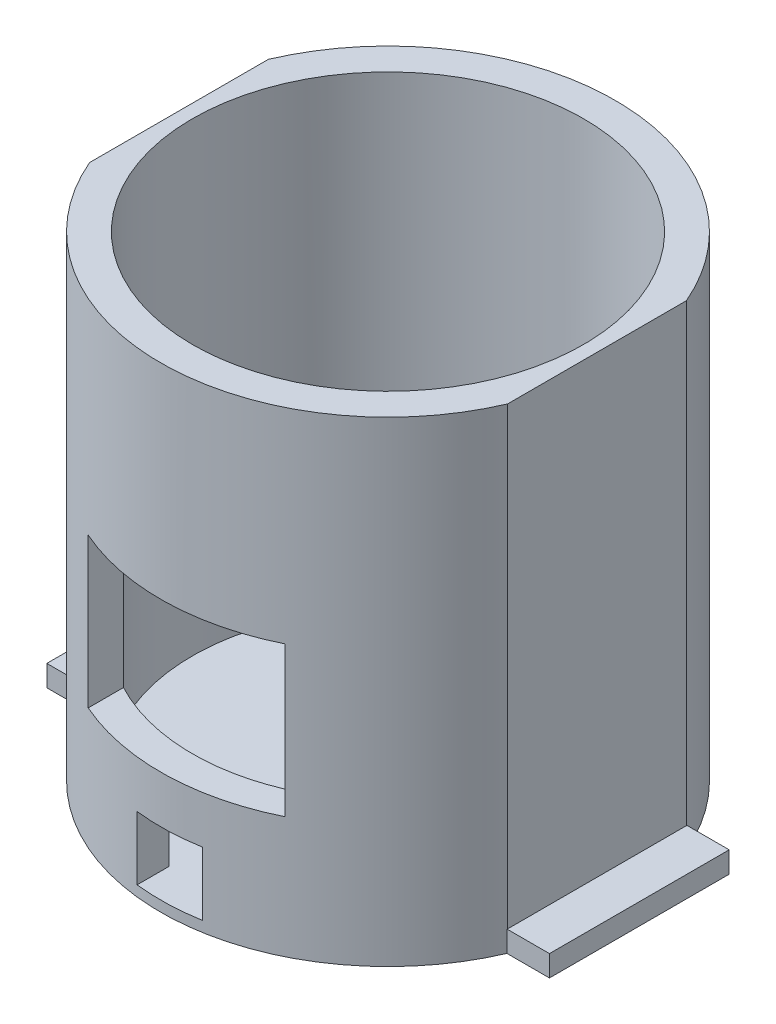
ISO-10303-21;
HEADER;
FILE_DESCRIPTION(('STEP AP214'),'2;1');
FILE_NAME('part.step','',(''),(''),'','','');
FILE_SCHEMA(('AUTOMOTIVE_DESIGN { 1 0 10303 214 1 1 1 1 }'));
ENDSEC;
DATA;
#1=APPLICATION_CONTEXT('core data for automotive mechanical design processes');
#2=APPLICATION_PROTOCOL_DEFINITION('international standard','automotive_design',2000,#1);
#3=PRODUCT_CONTEXT('',#1,'mechanical');
#4=PRODUCT('Part','Part','',(#3));
#5=PRODUCT_RELATED_PRODUCT_CATEGORY('part','',(#4));
#6=PRODUCT_DEFINITION_FORMATION('','',#4);
#7=PRODUCT_DEFINITION_CONTEXT('part definition',#1,'design');
#8=PRODUCT_DEFINITION('design','',#6,#7);
#9=PRODUCT_DEFINITION_SHAPE('','',#8);
#10=(LENGTH_UNIT() NAMED_UNIT(*) SI_UNIT(.MILLI.,.METRE.));
#11=(NAMED_UNIT(*) PLANE_ANGLE_UNIT() SI_UNIT($,.RADIAN.));
#12=(NAMED_UNIT(*) SI_UNIT($,.STERADIAN.) SOLID_ANGLE_UNIT());
#13=UNCERTAINTY_MEASURE_WITH_UNIT(LENGTH_MEASURE(1.E-05),#10,'distance_accuracy_value','');
#14=(GEOMETRIC_REPRESENTATION_CONTEXT(3) GLOBAL_UNCERTAINTY_ASSIGNED_CONTEXT((#13)) GLOBAL_UNIT_ASSIGNED_CONTEXT((#10,
#11,#12)) REPRESENTATION_CONTEXT('',''));
#15=CARTESIAN_POINT('',(0.,0.,0.));
#16=DIRECTION('',(0.,0.,1.));
#17=DIRECTION('',(1.,0.,0.));
#18=AXIS2_PLACEMENT_3D('',#15,#16,#17);
#19=CARTESIAN_POINT('',(19.7690481329593,45.,0.));
#20=DIRECTION('',(1.,0.,0.));
#21=DIRECTION('',(0.,0.,-1.));
#22=AXIS2_PLACEMENT_3D('',#19,#20,#21);
#23=PLANE('',#22);
#24=DIRECTION('',(0.,-1.,0.));
#25=VECTOR('',#24,1.);
#26=CARTESIAN_POINT('',(19.7690481329593,45.,8.45190723545503));
#27=LINE('',#26,#25);
#28=CARTESIAN_POINT('',(19.7690481329593,45.,8.45190723545503));
#29=VERTEX_POINT('',#28);
#30=CARTESIAN_POINT('',(19.7690481329593,2.,8.45190723545503));
#31=VERTEX_POINT('',#30);
#32=EDGE_CURVE('E402',#29,#31,#27,.T.);
#33=ORIENTED_EDGE('',*,*,#32,.T.);
#34=DIRECTION('',(0.,0.,-1.));
#35=VECTOR('',#34,1.);
#36=CARTESIAN_POINT('',(19.7690481329593,2.,8.5));
#37=LINE('',#36,#35);
#38=CARTESIAN_POINT('',(19.7690481329593,2.00000000000002,-8.45190723545503));
#39=VERTEX_POINT('',#38);
#40=EDGE_CURVE('E11',#31,#39,#37,.T.);
#41=ORIENTED_EDGE('',*,*,#40,.T.);
#42=DIRECTION('',(0.,-1.,0.));
#43=VECTOR('',#42,1.);
#44=CARTESIAN_POINT('',(19.7690481329593,45.,-8.45190723545503));
#45=LINE('',#44,#43);
#46=CARTESIAN_POINT('',(19.7690481329593,45.,-8.45190723545503));
#47=VERTEX_POINT('',#46);
#48=EDGE_CURVE('E398',#47,#39,#45,.T.);
#49=ORIENTED_EDGE('',*,*,#48,.F.);
#50=DIRECTION('',(0.,0.,1.));
#51=VECTOR('',#50,1.);
#52=CARTESIAN_POINT('',(19.7690481329593,45.,0.));
#53=LINE('',#52,#51);
#54=EDGE_CURVE('E374',#47,#29,#53,.T.);
#55=ORIENTED_EDGE('',*,*,#54,.T.);
#56=EDGE_LOOP('',(#33,#41,#49,#55));
#57=FACE_BOUND('',#56,.T.);
#58=ADVANCED_FACE('F45',(#57),#23,.T.);
#59=CARTESIAN_POINT('',(-19.7690481329593,45.,0.));
#60=DIRECTION('',(1.,0.,0.));
#61=DIRECTION('',(0.,0.,-1.));
#62=AXIS2_PLACEMENT_3D('',#59,#60,#61);
#63=PLANE('',#62);
#64=DIRECTION('',(0.,0.,-1.));
#65=VECTOR('',#64,1.);
#66=CARTESIAN_POINT('',(-19.7690481329593,2.,8.5));
#67=LINE('',#66,#65);
#68=CARTESIAN_POINT('',(-19.7690481329593,2.00000000000002,8.45190723545503));
#69=VERTEX_POINT('',#68);
#70=CARTESIAN_POINT('',(-19.7690481329593,2.,-8.45190723545502));
#71=VERTEX_POINT('',#70);
#72=EDGE_CURVE('E54',#69,#71,#67,.T.);
#73=ORIENTED_EDGE('',*,*,#72,.F.);
#74=DIRECTION('',(0.,-1.,0.));
#75=VECTOR('',#74,1.);
#76=CARTESIAN_POINT('',(-19.7690481329593,45.,8.45190723545503));
#77=LINE('',#76,#75);
#78=CARTESIAN_POINT('',(-19.7690481329593,45.,8.45190723545503));
#79=VERTEX_POINT('',#78);
#80=EDGE_CURVE('E390',#79,#69,#77,.T.);
#81=ORIENTED_EDGE('',*,*,#80,.F.);
#82=DIRECTION('',(0.,0.,1.));
#83=VECTOR('',#82,1.);
#84=CARTESIAN_POINT('',(-19.7690481329593,45.,0.));
#85=LINE('',#84,#83);
#86=CARTESIAN_POINT('',(-19.7690481329593,45.,-8.45190723545503));
#87=VERTEX_POINT('',#86);
#88=EDGE_CURVE('E380',#87,#79,#85,.T.);
#89=ORIENTED_EDGE('',*,*,#88,.F.);
#90=DIRECTION('',(0.,-1.,0.));
#91=VECTOR('',#90,1.);
#92=CARTESIAN_POINT('',(-19.7690481329593,45.,-8.45190723545503));
#93=LINE('',#92,#91);
#94=EDGE_CURVE('E394',#87,#71,#93,.T.);
#95=ORIENTED_EDGE('',*,*,#94,.T.);
#96=EDGE_LOOP('',(#73,#81,#89,#95));
#97=FACE_BOUND('',#96,.T.);
#98=ADVANCED_FACE('F491',(#97),#63,.F.);
#99=CARTESIAN_POINT('',(0.,45.,0.));
#100=DIRECTION('',(0.,-1.,0.));
#101=DIRECTION('',(0.,0.,-1.));
#102=AXIS2_PLACEMENT_3D('',#99,#100,#101);
#103=CYLINDRICAL_SURFACE('',#102,21.5);
#104=CARTESIAN_POINT('',(0.,25.6342182890855,0.));
#105=DIRECTION('',(0.,-1.,0.));
#106=DIRECTION('',(0.,0.,-1.));
#107=AXIS2_PLACEMENT_3D('',#104,#105,#106);
#108=CIRCLE('',#107,21.5);
#109=CARTESIAN_POINT('',(-8.68567682726975,25.6342182890855,19.6674608948951));
#110=VERTEX_POINT('',#109);
#111=CARTESIAN_POINT('',(9.52556538839725,25.6342182890855,19.2746881694975));
#112=VERTEX_POINT('',#111);
#113=EDGE_CURVE('E306',#110,#112,#108,.F.);
#114=ORIENTED_EDGE('',*,*,#113,.T.);
#115=DIRECTION('',(0.,-1.,0.));
#116=VECTOR('',#115,1.);
#117=CARTESIAN_POINT('',(9.52556538839724,45.,19.2746881694975));
#118=LINE('',#117,#116);
#119=CARTESIAN_POINT('',(9.52556538839724,11.4782038675844,19.2746881694975));
#120=VERTEX_POINT('',#119);
#121=EDGE_CURVE('E342',#112,#120,#118,.T.);
#122=ORIENTED_EDGE('',*,*,#121,.T.);
#123=CARTESIAN_POINT('',(0.,11.4782038675844,0.));
#124=DIRECTION('',(0.,1.,0.));
#125=DIRECTION('',(0.,0.,1.));
#126=AXIS2_PLACEMENT_3D('',#123,#124,#125);
#127=CIRCLE('',#126,21.5);
#128=CARTESIAN_POINT('',(-8.68567682726975,11.4782038675844,19.6674608948951));
#129=VERTEX_POINT('',#128);
#130=EDGE_CURVE('E347',#120,#129,#127,.F.);
#131=ORIENTED_EDGE('',*,*,#130,.T.);
#132=DIRECTION('',(0.,-1.,0.));
#133=VECTOR('',#132,1.);
#134=CARTESIAN_POINT('',(-8.68567682726975,45.,19.6674608948951));
#135=LINE('',#134,#133);
#136=EDGE_CURVE('E337',#129,#110,#135,.F.);
#137=ORIENTED_EDGE('',*,*,#136,.T.);
#138=EDGE_LOOP('',(#114,#122,#131,#137));
#139=FACE_BOUND('',#138,.T.);
#140=CARTESIAN_POINT('',(0.,0.,0.));
#141=DIRECTION('',(0.,1.,0.));
#142=DIRECTION('',(0.,0.,1.));
#143=AXIS2_PLACEMENT_3D('',#140,#141,#142);
#144=CIRCLE('',#143,21.5);
#145=CARTESIAN_POINT('',(-19.7690481329593,0.,8.45190723545503));
#146=VERTEX_POINT('',#145);
#147=CARTESIAN_POINT('',(19.7690481329593,0.,8.45190723545503));
#148=VERTEX_POINT('',#147);
#149=EDGE_CURVE('E370',#146,#148,#144,.T.);
#150=ORIENTED_EDGE('',*,*,#149,.T.);
#151=EDGE_CURVE('E204',#31,#148,#27,.T.);
#152=ORIENTED_EDGE('',*,*,#151,.F.);
#153=ORIENTED_EDGE('',*,*,#32,.F.);
#154=CARTESIAN_POINT('',(0.,45.,0.));
#155=DIRECTION('',(0.,1.,0.));
#156=DIRECTION('',(0.,0.,1.));
#157=AXIS2_PLACEMENT_3D('',#154,#155,#156);
#158=CIRCLE('',#157,21.5);
#159=EDGE_CURVE('E371',#79,#29,#158,.T.);
#160=ORIENTED_EDGE('',*,*,#159,.F.);
#161=ORIENTED_EDGE('',*,*,#80,.T.);
#162=EDGE_CURVE('E387',#69,#146,#77,.T.);
#163=ORIENTED_EDGE('',*,*,#162,.T.);
#164=EDGE_LOOP('',(#150,#152,#153,#160,#161,#163));
#165=FACE_BOUND('',#164,.T.);
#166=CARTESIAN_POINT('',(0.,7.,0.));
#167=DIRECTION('',(0.,-1.,0.));
#168=DIRECTION('',(0.,0.,-1.));
#169=AXIS2_PLACEMENT_3D('',#166,#167,#168);
#170=CIRCLE('',#169,21.5);
#171=CARTESIAN_POINT('',(-2.35937857857948,7.,21.3701505077278));
#172=VERTEX_POINT('',#171);
#173=CARTESIAN_POINT('',(3.64062142142052,7.,21.1895227805133));
#174=VERTEX_POINT('',#173);
#175=EDGE_CURVE('E301',#172,#174,#170,.F.);
#176=ORIENTED_EDGE('',*,*,#175,.T.);
#177=DIRECTION('',(0.,-1.,0.));
#178=VECTOR('',#177,1.);
#179=CARTESIAN_POINT('',(3.64062142142052,45.,21.1895227805133));
#180=LINE('',#179,#178);
#181=CARTESIAN_POINT('',(3.64062142142052,1.,21.1895227805133));
#182=VERTEX_POINT('',#181);
#183=EDGE_CURVE('E318',#174,#182,#180,.T.);
#184=ORIENTED_EDGE('',*,*,#183,.T.);
#185=CARTESIAN_POINT('',(0.,1.,0.));
#186=DIRECTION('',(0.,1.,0.));
#187=DIRECTION('',(0.,0.,1.));
#188=AXIS2_PLACEMENT_3D('',#185,#186,#187);
#189=CIRCLE('',#188,21.5);
#190=CARTESIAN_POINT('',(-2.35937857857948,1.,21.3701505077278));
#191=VERTEX_POINT('',#190);
#192=EDGE_CURVE('E313',#182,#191,#189,.F.);
#193=ORIENTED_EDGE('',*,*,#192,.T.);
#194=DIRECTION('',(0.,-1.,0.));
#195=VECTOR('',#194,1.);
#196=CARTESIAN_POINT('',(-2.35937857857948,45.,21.3701505077278));
#197=LINE('',#196,#195);
#198=EDGE_CURVE('E307',#191,#172,#197,.F.);
#199=ORIENTED_EDGE('',*,*,#198,.T.);
#200=EDGE_LOOP('',(#176,#184,#193,#199));
#201=FACE_BOUND('',#200,.T.);
#202=ADVANCED_FACE('F480',(#139,#165,#201),#103,.T.);
#203=CARTESIAN_POINT('',(0.,45.,0.));
#204=DIRECTION('',(0.,-1.,0.));
#205=DIRECTION('',(0.,0.,-1.));
#206=AXIS2_PLACEMENT_3D('',#203,#204,#205);
#207=CYLINDRICAL_SURFACE('',#206,18.5);
#208=CARTESIAN_POINT('',(0.,45.,0.));
#209=DIRECTION('',(0.,1.,0.));
#210=DIRECTION('',(0.,0.,1.));
#211=AXIS2_PLACEMENT_3D('',#208,#209,#210);
#212=CIRCLE('',#211,18.5);
#213=CARTESIAN_POINT('',(0.,45.,18.5));
#214=VERTEX_POINT('',#213);
#215=EDGE_CURVE('E383',#214,#214,#212,.T.);
#216=ORIENTED_EDGE('',*,*,#215,.T.);
#217=EDGE_LOOP('',(#216));
#218=FACE_BOUND('',#217,.T.);
#219=DIRECTION('',(0.,-1.,0.));
#220=VECTOR('',#219,1.);
#221=CARTESIAN_POINT('',(9.52556538839724,45.,15.8591804337856));
#222=LINE('',#221,#220);
#223=CARTESIAN_POINT('',(9.52556538839725,11.4782038675844,15.8591804337856));
#224=VERTEX_POINT('',#223);
#225=CARTESIAN_POINT('',(9.52556538839725,25.6342182890855,15.8591804337856));
#226=VERTEX_POINT('',#225);
#227=EDGE_CURVE('E418',#224,#226,#222,.F.);
#228=ORIENTED_EDGE('',*,*,#227,.T.);
#229=CARTESIAN_POINT('',(0.,25.6342182890855,0.));
#230=DIRECTION('',(0.,-1.,0.));
#231=DIRECTION('',(0.,0.,-1.));
#232=AXIS2_PLACEMENT_3D('',#229,#230,#231);
#233=CIRCLE('',#232,18.5);
#234=CARTESIAN_POINT('',(-8.68567682726975,25.6342182890855,16.3342896402699));
#235=VERTEX_POINT('',#234);
#236=EDGE_CURVE('E421',#226,#235,#233,.T.);
#237=ORIENTED_EDGE('',*,*,#236,.T.);
#238=DIRECTION('',(0.,-1.,0.));
#239=VECTOR('',#238,1.);
#240=CARTESIAN_POINT('',(-8.68567682726975,45.,16.3342896402699));
#241=LINE('',#240,#239);
#242=CARTESIAN_POINT('',(-8.68567682726975,11.4782038675844,16.3342896402699));
#243=VERTEX_POINT('',#242);
#244=EDGE_CURVE('E410',#235,#243,#241,.T.);
#245=ORIENTED_EDGE('',*,*,#244,.T.);
#246=CARTESIAN_POINT('',(0.,11.4782038675844,0.));
#247=DIRECTION('',(0.,1.,0.));
#248=DIRECTION('',(0.,0.,1.));
#249=AXIS2_PLACEMENT_3D('',#246,#247,#248);
#250=CIRCLE('',#249,18.5);
#251=EDGE_CURVE('E414',#243,#224,#250,.T.);
#252=ORIENTED_EDGE('',*,*,#251,.T.);
#253=EDGE_LOOP('',(#228,#237,#245,#252));
#254=FACE_BOUND('',#253,.T.);
#255=CARTESIAN_POINT('',(0.,1.,0.));
#256=DIRECTION('',(0.,1.,0.));
#257=DIRECTION('',(0.,0.,1.));
#258=AXIS2_PLACEMENT_3D('',#255,#256,#257);
#259=CIRCLE('',#258,18.5);
#260=CARTESIAN_POINT('',(3.64062142142052,1.,18.1382434559109));
#261=VERTEX_POINT('',#260);
#262=CARTESIAN_POINT('',(-2.35937857857948,1.,18.3489327407057));
#263=VERTEX_POINT('',#262);
#264=EDGE_CURVE('E406',#261,#263,#259,.T.);
#265=ORIENTED_EDGE('',*,*,#264,.F.);
#266=DIRECTION('',(0.,-1.,0.));
#267=VECTOR('',#266,1.);
#268=CARTESIAN_POINT('',(3.64062142142052,45.,18.1382434559109));
#269=LINE('',#268,#267);
#270=CARTESIAN_POINT('',(3.64062142142052,7.,18.1382434559109));
#271=VERTEX_POINT('',#270);
#272=EDGE_CURVE('E366',#261,#271,#269,.F.);
#273=ORIENTED_EDGE('',*,*,#272,.T.);
#274=CARTESIAN_POINT('',(0.,7.,0.));
#275=DIRECTION('',(0.,-1.,0.));
#276=DIRECTION('',(0.,0.,-1.));
#277=AXIS2_PLACEMENT_3D('',#274,#275,#276);
#278=CIRCLE('',#277,18.5);
#279=CARTESIAN_POINT('',(-2.35937857857948,7.,18.3489327407057));
#280=VERTEX_POINT('',#279);
#281=EDGE_CURVE('E48',#271,#280,#278,.T.);
#282=ORIENTED_EDGE('',*,*,#281,.T.);
#283=DIRECTION('',(0.,-1.,0.));
#284=VECTOR('',#283,1.);
#285=CARTESIAN_POINT('',(-2.35937857857948,45.,18.3489327407057));
#286=LINE('',#285,#284);
#287=EDGE_CURVE('E333',#280,#263,#286,.T.);
#288=ORIENTED_EDGE('',*,*,#287,.T.);
#289=EDGE_LOOP('',(#265,#273,#282,#288));
#290=FACE_BOUND('',#289,.T.);
#291=ADVANCED_FACE('F498',(#218,#254,#290),#207,.F.);
#292=CARTESIAN_POINT('',(19.7690481329593,0.,-8.45190723545502));
#293=VERTEX_POINT('',#292);
#294=CARTESIAN_POINT('',(-19.7690481329593,0.,-8.45190723545503));
#295=VERTEX_POINT('',#294);
#296=EDGE_CURVE('E375',#293,#295,#144,.T.);
#297=ORIENTED_EDGE('',*,*,#296,.T.);
#298=EDGE_CURVE('E393',#71,#295,#93,.T.);
#299=ORIENTED_EDGE('',*,*,#298,.F.);
#300=ORIENTED_EDGE('',*,*,#94,.F.);
#301=EDGE_CURVE('E376',#47,#87,#158,.T.);
#302=ORIENTED_EDGE('',*,*,#301,.F.);
#303=ORIENTED_EDGE('',*,*,#48,.T.);
#304=EDGE_CURVE('E397',#39,#293,#45,.T.);
#305=ORIENTED_EDGE('',*,*,#304,.T.);
#306=EDGE_LOOP('',(#297,#299,#300,#302,#303,#305));
#307=FACE_BOUND('',#306,.T.);
#308=ADVANCED_FACE('F467',(#307),#103,.T.);
#309=CARTESIAN_POINT('',(0.,45.,0.));
#310=DIRECTION('',(0.,1.,0.));
#311=DIRECTION('',(0.,0.,1.));
#312=AXIS2_PLACEMENT_3D('',#309,#310,#311);
#313=PLANE('',#312);
#314=ORIENTED_EDGE('',*,*,#159,.T.);
#315=ORIENTED_EDGE('',*,*,#54,.F.);
#316=ORIENTED_EDGE('',*,*,#301,.T.);
#317=ORIENTED_EDGE('',*,*,#88,.T.);
#318=EDGE_LOOP('',(#314,#315,#316,#317));
#319=FACE_BOUND('',#318,.T.);
#320=ORIENTED_EDGE('',*,*,#215,.F.);
#321=EDGE_LOOP('',(#320));
#322=FACE_BOUND('',#321,.T.);
#323=ADVANCED_FACE('F488',(#319,#322),#313,.T.);
#324=CARTESIAN_POINT('',(0.,0.,0.));
#325=DIRECTION('',(0.,1.,0.));
#326=DIRECTION('',(0.,0.,1.));
#327=AXIS2_PLACEMENT_3D('',#324,#325,#326);
#328=PLANE('',#327);
#329=ORIENTED_EDGE('',*,*,#149,.F.);
#330=DIRECTION('',(0.,0.,-1.));
#331=VECTOR('',#330,1.);
#332=CARTESIAN_POINT('',(-19.7690481329593,0.,8.5));
#333=LINE('',#332,#331);
#334=CARTESIAN_POINT('',(-19.7690481329593,0.,8.5));
#335=VERTEX_POINT('',#334);
#336=EDGE_CURVE('E283',#335,#146,#333,.T.);
#337=ORIENTED_EDGE('',*,*,#336,.F.);
#338=DIRECTION('',(1.,0.,0.));
#339=VECTOR('',#338,1.);
#340=CARTESIAN_POINT('',(-19.7690481329593,0.,8.5));
#341=LINE('',#340,#339);
#342=CARTESIAN_POINT('',(-23.7690481329593,0.,8.5));
#343=VERTEX_POINT('',#342);
#344=EDGE_CURVE('E267',#343,#335,#341,.T.);
#345=ORIENTED_EDGE('',*,*,#344,.F.);
#346=DIRECTION('',(0.,0.,-1.));
#347=VECTOR('',#346,1.);
#348=CARTESIAN_POINT('',(-23.7690481329593,0.,8.5));
#349=LINE('',#348,#347);
#350=CARTESIAN_POINT('',(-23.7690481329593,0.,-8.5));
#351=VERTEX_POINT('',#350);
#352=EDGE_CURVE('E287',#343,#351,#349,.T.);
#353=ORIENTED_EDGE('',*,*,#352,.T.);
#354=DIRECTION('',(1.,0.,0.));
#355=VECTOR('',#354,1.);
#356=CARTESIAN_POINT('',(-19.7690481329593,0.,-8.5));
#357=LINE('',#356,#355);
#358=CARTESIAN_POINT('',(-19.7690481329593,0.,-8.5));
#359=VERTEX_POINT('',#358);
#360=EDGE_CURVE('E261',#351,#359,#357,.T.);
#361=ORIENTED_EDGE('',*,*,#360,.T.);
#362=EDGE_CURVE('E270',#295,#359,#333,.T.);
#363=ORIENTED_EDGE('',*,*,#362,.F.);
#364=ORIENTED_EDGE('',*,*,#296,.F.);
#365=DIRECTION('',(0.,0.,-1.));
#366=VECTOR('',#365,1.);
#367=CARTESIAN_POINT('',(19.7690481329593,0.,8.5));
#368=LINE('',#367,#366);
#369=CARTESIAN_POINT('',(19.7690481329593,0.,-8.5));
#370=VERTEX_POINT('',#369);
#371=EDGE_CURVE('E211',#293,#370,#368,.T.);
#372=ORIENTED_EDGE('',*,*,#371,.T.);
#373=DIRECTION('',(-1.,0.,0.));
#374=VECTOR('',#373,1.);
#375=CARTESIAN_POINT('',(19.7690481329593,0.,-8.5));
#376=LINE('',#375,#374);
#377=CARTESIAN_POINT('',(23.7690481329593,0.,-8.5));
#378=VERTEX_POINT('',#377);
#379=EDGE_CURVE('E239',#378,#370,#376,.T.);
#380=ORIENTED_EDGE('',*,*,#379,.F.);
#381=DIRECTION('',(0.,0.,-1.));
#382=VECTOR('',#381,1.);
#383=CARTESIAN_POINT('',(23.7690481329593,0.,8.5));
#384=LINE('',#383,#382);
#385=CARTESIAN_POINT('',(23.7690481329593,0.,8.5));
#386=VERTEX_POINT('',#385);
#387=EDGE_CURVE('E226',#386,#378,#384,.T.);
#388=ORIENTED_EDGE('',*,*,#387,.F.);
#389=DIRECTION('',(-1.,0.,0.));
#390=VECTOR('',#389,1.);
#391=CARTESIAN_POINT('',(19.7690481329593,0.,8.5));
#392=LINE('',#391,#390);
#393=CARTESIAN_POINT('',(19.7690481329593,0.,8.5));
#394=VERTEX_POINT('',#393);
#395=EDGE_CURVE('E217',#386,#394,#392,.T.);
#396=ORIENTED_EDGE('',*,*,#395,.T.);
#397=EDGE_CURVE('E197',#394,#148,#368,.T.);
#398=ORIENTED_EDGE('',*,*,#397,.T.);
#399=EDGE_LOOP('',(#329,#337,#345,#353,#361,#363,#364,#372,#380,#388,#396,#398));
#400=FACE_BOUND('',#399,.T.);
#401=ADVANCED_FACE('F224',(#400),#328,.F.);
#402=CARTESIAN_POINT('',(0.,1.,0.));
#403=DIRECTION('',(0.,1.,0.));
#404=DIRECTION('',(0.,0.,1.));
#405=AXIS2_PLACEMENT_3D('',#402,#403,#404);
#406=PLANE('',#405);
#407=ORIENTED_EDGE('',*,*,#264,.T.);
#408=DIRECTION('',(0.,0.,-1.));
#409=VECTOR('',#408,1.);
#410=CARTESIAN_POINT('',(-2.35937857857948,1.,21.501));
#411=LINE('',#410,#409);
#412=EDGE_CURVE('E312',#191,#263,#411,.T.);
#413=ORIENTED_EDGE('',*,*,#412,.F.);
#414=ORIENTED_EDGE('',*,*,#192,.F.);
#415=DIRECTION('',(0.,0.,-1.));
#416=VECTOR('',#415,1.);
#417=CARTESIAN_POINT('',(3.64062142142052,1.,21.501));
#418=LINE('',#417,#416);
#419=EDGE_CURVE('E317',#182,#261,#418,.T.);
#420=ORIENTED_EDGE('',*,*,#419,.T.);
#421=EDGE_LOOP('',(#407,#413,#414,#420));
#422=FACE_BOUND('',#421,.T.);
#423=ADVANCED_FACE('F515',(#422),#406,.T.);
#424=CARTESIAN_POINT('',(-8.68567682726975,25.6342182890855,21.501));
#425=DIRECTION('',(0.,-1.,0.));
#426=DIRECTION('',(0.,0.,-1.));
#427=AXIS2_PLACEMENT_3D('',#424,#425,#426);
#428=PLANE('',#427);
#429=DIRECTION('',(0.,0.,-1.));
#430=VECTOR('',#429,1.);
#431=CARTESIAN_POINT('',(9.52556538839725,25.6342182890855,21.501));
#432=LINE('',#431,#430);
#433=EDGE_CURVE('E338',#112,#226,#432,.T.);
#434=ORIENTED_EDGE('',*,*,#433,.F.);
#435=ORIENTED_EDGE('',*,*,#113,.F.);
#436=DIRECTION('',(0.,0.,-1.));
#437=VECTOR('',#436,1.);
#438=CARTESIAN_POINT('',(-8.68567682726975,25.6342182890855,21.501));
#439=LINE('',#438,#437);
#440=EDGE_CURVE('E300',#110,#235,#439,.T.);
#441=ORIENTED_EDGE('',*,*,#440,.T.);
#442=ORIENTED_EDGE('',*,*,#236,.F.);
#443=EDGE_LOOP('',(#434,#435,#441,#442));
#444=FACE_BOUND('',#443,.T.);
#445=ADVANCED_FACE('F538',(#444),#428,.T.);
#446=CARTESIAN_POINT('',(9.52556538839725,25.6342182890855,21.501));
#447=DIRECTION('',(-1.,0.,0.));
#448=DIRECTION('',(0.,-1.,0.));
#449=AXIS2_PLACEMENT_3D('',#446,#447,#448);
#450=PLANE('',#449);
#451=DIRECTION('',(0.,0.,-1.));
#452=VECTOR('',#451,1.);
#453=CARTESIAN_POINT('',(9.52556538839725,11.4782038675844,21.501));
#454=LINE('',#453,#452);
#455=EDGE_CURVE('E343',#120,#224,#454,.T.);
#456=ORIENTED_EDGE('',*,*,#455,.F.);
#457=ORIENTED_EDGE('',*,*,#121,.F.);
#458=ORIENTED_EDGE('',*,*,#433,.T.);
#459=ORIENTED_EDGE('',*,*,#227,.F.);
#460=EDGE_LOOP('',(#456,#457,#458,#459));
#461=FACE_BOUND('',#460,.T.);
#462=ADVANCED_FACE('F541',(#461),#450,.T.);
#463=CARTESIAN_POINT('',(-8.68567682726975,11.4782038675844,21.501));
#464=DIRECTION('',(0.,1.,0.));
#465=DIRECTION('',(0.,0.,1.));
#466=AXIS2_PLACEMENT_3D('',#463,#464,#465);
#467=PLANE('',#466);
#468=DIRECTION('',(0.,0.,-1.));
#469=VECTOR('',#468,1.);
#470=CARTESIAN_POINT('',(-8.68567682726975,11.4782038675844,21.501));
#471=LINE('',#470,#469);
#472=EDGE_CURVE('E348',#129,#243,#471,.T.);
#473=ORIENTED_EDGE('',*,*,#472,.F.);
#474=ORIENTED_EDGE('',*,*,#130,.F.);
#475=ORIENTED_EDGE('',*,*,#455,.T.);
#476=ORIENTED_EDGE('',*,*,#251,.F.);
#477=EDGE_LOOP('',(#473,#474,#475,#476));
#478=FACE_BOUND('',#477,.T.);
#479=ADVANCED_FACE('F545',(#478),#467,.T.);
#480=CARTESIAN_POINT('',(-8.68567682726975,25.6342182890855,21.501));
#481=DIRECTION('',(1.,0.,0.));
#482=DIRECTION('',(0.,1.,0.));
#483=AXIS2_PLACEMENT_3D('',#480,#481,#482);
#484=PLANE('',#483);
#485=ORIENTED_EDGE('',*,*,#440,.F.);
#486=ORIENTED_EDGE('',*,*,#136,.F.);
#487=ORIENTED_EDGE('',*,*,#472,.T.);
#488=ORIENTED_EDGE('',*,*,#244,.F.);
#489=EDGE_LOOP('',(#485,#486,#487,#488));
#490=FACE_BOUND('',#489,.T.);
#491=ADVANCED_FACE('F537',(#490),#484,.T.);
#492=CARTESIAN_POINT('',(-2.35937857857948,7.,21.501));
#493=DIRECTION('',(0.,-1.,0.));
#494=DIRECTION('',(0.,0.,-1.));
#495=AXIS2_PLACEMENT_3D('',#492,#493,#494);
#496=PLANE('',#495);
#497=DIRECTION('',(0.,0.,-1.));
#498=VECTOR('',#497,1.);
#499=CARTESIAN_POINT('',(3.64062142142052,7.,21.501));
#500=LINE('',#499,#498);
#501=EDGE_CURVE('E305',#174,#271,#500,.T.);
#502=ORIENTED_EDGE('',*,*,#501,.F.);
#503=ORIENTED_EDGE('',*,*,#175,.F.);
#504=DIRECTION('',(0.,0.,-1.));
#505=VECTOR('',#504,1.);
#506=CARTESIAN_POINT('',(-2.35937857857948,7.,21.501));
#507=LINE('',#506,#505);
#508=EDGE_CURVE('E311',#172,#280,#507,.T.);
#509=ORIENTED_EDGE('',*,*,#508,.T.);
#510=ORIENTED_EDGE('',*,*,#281,.F.);
#511=EDGE_LOOP('',(#502,#503,#509,#510));
#512=FACE_BOUND('',#511,.T.);
#513=ADVANCED_FACE('F522',(#512),#496,.T.);
#514=CARTESIAN_POINT('',(3.64062142142052,1.,21.501));
#515=DIRECTION('',(-1.,0.,0.));
#516=DIRECTION('',(0.,0.,1.));
#517=AXIS2_PLACEMENT_3D('',#514,#515,#516);
#518=PLANE('',#517);
#519=ORIENTED_EDGE('',*,*,#419,.F.);
#520=ORIENTED_EDGE('',*,*,#183,.F.);
#521=ORIENTED_EDGE('',*,*,#501,.T.);
#522=ORIENTED_EDGE('',*,*,#272,.F.);
#523=EDGE_LOOP('',(#519,#520,#521,#522));
#524=FACE_BOUND('',#523,.T.);
#525=ADVANCED_FACE('F518',(#524),#518,.T.);
#526=CARTESIAN_POINT('',(-2.35937857857948,1.,21.501));
#527=DIRECTION('',(1.,0.,0.));
#528=DIRECTION('',(0.,0.,-1.));
#529=AXIS2_PLACEMENT_3D('',#526,#527,#528);
#530=PLANE('',#529);
#531=ORIENTED_EDGE('',*,*,#508,.F.);
#532=ORIENTED_EDGE('',*,*,#198,.F.);
#533=ORIENTED_EDGE('',*,*,#412,.T.);
#534=ORIENTED_EDGE('',*,*,#287,.F.);
#535=EDGE_LOOP('',(#531,#532,#533,#534));
#536=FACE_BOUND('',#535,.T.);
#537=ADVANCED_FACE('F524',(#536),#530,.T.);
#538=CARTESIAN_POINT('',(-19.7690481329593,0.,8.5));
#539=DIRECTION('',(-1.,0.,0.));
#540=DIRECTION('',(0.,0.,1.));
#541=AXIS2_PLACEMENT_3D('',#538,#539,#540);
#542=PLANE('',#541);
#543=CARTESIAN_POINT('',(-19.7690481329593,2.,-8.5));
#544=VERTEX_POINT('',#543);
#545=EDGE_CURVE('E295',#71,#544,#67,.T.);
#546=ORIENTED_EDGE('',*,*,#545,.F.);
#547=ORIENTED_EDGE('',*,*,#298,.T.);
#548=ORIENTED_EDGE('',*,*,#362,.T.);
#549=DIRECTION('',(0.,1.,0.));
#550=VECTOR('',#549,1.);
#551=CARTESIAN_POINT('',(-19.7690481329593,0.,-8.5));
#552=LINE('',#551,#550);
#553=EDGE_CURVE('E210',#359,#544,#552,.T.);
#554=ORIENTED_EDGE('',*,*,#553,.T.);
#555=EDGE_LOOP('',(#546,#547,#548,#554));
#556=FACE_BOUND('',#555,.T.);
#557=ADVANCED_FACE('F442',(#556),#542,.F.);
#558=ORIENTED_EDGE('',*,*,#162,.F.);
#559=CARTESIAN_POINT('',(-19.7690481329593,2.,8.5));
#560=VERTEX_POINT('',#559);
#561=EDGE_CURVE('E296',#560,#69,#67,.T.);
#562=ORIENTED_EDGE('',*,*,#561,.F.);
#563=DIRECTION('',(0.,1.,0.));
#564=VECTOR('',#563,1.);
#565=CARTESIAN_POINT('',(-19.7690481329593,0.,8.5));
#566=LINE('',#565,#564);
#567=EDGE_CURVE('E256',#335,#560,#566,.T.);
#568=ORIENTED_EDGE('',*,*,#567,.F.);
#569=ORIENTED_EDGE('',*,*,#336,.T.);
#570=EDGE_LOOP('',(#558,#562,#568,#569));
#571=FACE_BOUND('',#570,.T.);
#572=ADVANCED_FACE('F459',(#571),#542,.F.);
#573=CARTESIAN_POINT('',(-19.7690481329593,2.,8.5));
#574=DIRECTION('',(0.,-1.,0.));
#575=DIRECTION('',(1.,0.,0.));
#576=AXIS2_PLACEMENT_3D('',#573,#574,#575);
#577=PLANE('',#576);
#578=DIRECTION('',(-1.,0.,0.));
#579=VECTOR('',#578,1.);
#580=CARTESIAN_POINT('',(-19.7690481329593,2.,-8.5));
#581=LINE('',#580,#579);
#582=CARTESIAN_POINT('',(-23.7690481329593,2.,-8.5));
#583=VERTEX_POINT('',#582);
#584=EDGE_CURVE('E274',#544,#583,#581,.T.);
#585=ORIENTED_EDGE('',*,*,#584,.T.);
#586=DIRECTION('',(0.,0.,-1.));
#587=VECTOR('',#586,1.);
#588=CARTESIAN_POINT('',(-23.7690481329593,2.,8.5));
#589=LINE('',#588,#587);
#590=CARTESIAN_POINT('',(-23.7690481329593,2.,8.5));
#591=VERTEX_POINT('',#590);
#592=EDGE_CURVE('E291',#591,#583,#589,.T.);
#593=ORIENTED_EDGE('',*,*,#592,.F.);
#594=DIRECTION('',(-1.,0.,0.));
#595=VECTOR('',#594,1.);
#596=CARTESIAN_POINT('',(-19.7690481329593,2.,8.5));
#597=LINE('',#596,#595);
#598=EDGE_CURVE('E260',#560,#591,#597,.T.);
#599=ORIENTED_EDGE('',*,*,#598,.F.);
#600=ORIENTED_EDGE('',*,*,#561,.T.);
#601=ORIENTED_EDGE('',*,*,#72,.T.);
#602=ORIENTED_EDGE('',*,*,#545,.T.);
#603=EDGE_LOOP('',(#585,#593,#599,#600,#601,#602));
#604=FACE_BOUND('',#603,.T.);
#605=ADVANCED_FACE('F433',(#604),#577,.F.);
#606=CARTESIAN_POINT('',(-23.7690481329593,0.,8.5));
#607=DIRECTION('',(1.,0.,0.));
#608=DIRECTION('',(0.,0.,-1.));
#609=AXIS2_PLACEMENT_3D('',#606,#607,#608);
#610=PLANE('',#609);
#611=DIRECTION('',(0.,-1.,0.));
#612=VECTOR('',#611,1.);
#613=CARTESIAN_POINT('',(-23.7690481329593,0.,-8.5));
#614=LINE('',#613,#612);
#615=EDGE_CURVE('E277',#583,#351,#614,.T.);
#616=ORIENTED_EDGE('',*,*,#615,.T.);
#617=ORIENTED_EDGE('',*,*,#352,.F.);
#618=DIRECTION('',(0.,-1.,0.));
#619=VECTOR('',#618,1.);
#620=CARTESIAN_POINT('',(-23.7690481329593,0.,8.5));
#621=LINE('',#620,#619);
#622=EDGE_CURVE('E264',#591,#343,#621,.T.);
#623=ORIENTED_EDGE('',*,*,#622,.F.);
#624=ORIENTED_EDGE('',*,*,#592,.T.);
#625=EDGE_LOOP('',(#616,#617,#623,#624));
#626=FACE_BOUND('',#625,.T.);
#627=ADVANCED_FACE('F452',(#626),#610,.F.);
#628=CARTESIAN_POINT('',(0.,0.,8.5));
#629=DIRECTION('',(0.,0.,1.));
#630=DIRECTION('',(1.,0.,0.));
#631=AXIS2_PLACEMENT_3D('',#628,#629,#630);
#632=PLANE('',#631);
#633=ORIENTED_EDGE('',*,*,#567,.T.);
#634=ORIENTED_EDGE('',*,*,#598,.T.);
#635=ORIENTED_EDGE('',*,*,#622,.T.);
#636=ORIENTED_EDGE('',*,*,#344,.T.);
#637=EDGE_LOOP('',(#633,#634,#635,#636));
#638=FACE_BOUND('',#637,.T.);
#639=ADVANCED_FACE('F456',(#638),#632,.T.);
#640=CARTESIAN_POINT('',(0.,0.,-8.5));
#641=DIRECTION('',(0.,0.,1.));
#642=DIRECTION('',(1.,0.,0.));
#643=AXIS2_PLACEMENT_3D('',#640,#641,#642);
#644=PLANE('',#643);
#645=ORIENTED_EDGE('',*,*,#553,.F.);
#646=ORIENTED_EDGE('',*,*,#360,.F.);
#647=ORIENTED_EDGE('',*,*,#615,.F.);
#648=ORIENTED_EDGE('',*,*,#584,.F.);
#649=EDGE_LOOP('',(#645,#646,#647,#648));
#650=FACE_BOUND('',#649,.T.);
#651=ADVANCED_FACE('F440',(#650),#644,.F.);
#652=CARTESIAN_POINT('',(19.7690481329593,0.,8.5));
#653=DIRECTION('',(-1.,0.,0.));
#654=DIRECTION('',(0.,0.,1.));
#655=AXIS2_PLACEMENT_3D('',#652,#653,#654);
#656=PLANE('',#655);
#657=ORIENTED_EDGE('',*,*,#304,.F.);
#658=CARTESIAN_POINT('',(19.7690481329593,2.,-8.5));
#659=VERTEX_POINT('',#658);
#660=EDGE_CURVE('E57',#39,#659,#37,.T.);
#661=ORIENTED_EDGE('',*,*,#660,.T.);
#662=DIRECTION('',(0.,1.,0.));
#663=VECTOR('',#662,1.);
#664=CARTESIAN_POINT('',(19.7690481329593,0.,-8.5));
#665=LINE('',#664,#663);
#666=EDGE_CURVE('E235',#370,#659,#665,.T.);
#667=ORIENTED_EDGE('',*,*,#666,.F.);
#668=ORIENTED_EDGE('',*,*,#371,.F.);
#669=EDGE_LOOP('',(#657,#661,#667,#668));
#670=FACE_BOUND('',#669,.T.);
#671=ADVANCED_FACE('F472',(#670),#656,.T.);
#672=CARTESIAN_POINT('',(19.7690481329593,2.,8.5));
#673=VERTEX_POINT('',#672);
#674=EDGE_CURVE('E56',#673,#31,#37,.T.);
#675=ORIENTED_EDGE('',*,*,#674,.T.);
#676=ORIENTED_EDGE('',*,*,#151,.T.);
#677=ORIENTED_EDGE('',*,*,#397,.F.);
#678=DIRECTION('',(0.,1.,0.));
#679=VECTOR('',#678,1.);
#680=CARTESIAN_POINT('',(19.7690481329593,0.,8.5));
#681=LINE('',#680,#679);
#682=EDGE_CURVE('E201',#394,#673,#681,.T.);
#683=ORIENTED_EDGE('',*,*,#682,.T.);
#684=EDGE_LOOP('',(#675,#676,#677,#683));
#685=FACE_BOUND('',#684,.T.);
#686=ADVANCED_FACE('F200',(#685),#656,.T.);
#687=CARTESIAN_POINT('',(23.7690481329593,0.,8.5));
#688=DIRECTION('',(1.,0.,0.));
#689=DIRECTION('',(0.,0.,-1.));
#690=AXIS2_PLACEMENT_3D('',#687,#688,#689);
#691=PLANE('',#690);
#692=DIRECTION('',(0.,-1.,0.));
#693=VECTOR('',#692,1.);
#694=CARTESIAN_POINT('',(23.7690481329593,0.,-8.5));
#695=LINE('',#694,#693);
#696=CARTESIAN_POINT('',(23.7690481329593,2.,-8.5));
#697=VERTEX_POINT('',#696);
#698=EDGE_CURVE('E243',#697,#378,#695,.T.);
#699=ORIENTED_EDGE('',*,*,#698,.F.);
#700=DIRECTION('',(0.,0.,-1.));
#701=VECTOR('',#700,1.);
#702=CARTESIAN_POINT('',(23.7690481329593,2.,8.5));
#703=LINE('',#702,#701);
#704=CARTESIAN_POINT('',(23.7690481329593,2.,8.5));
#705=VERTEX_POINT('',#704);
#706=EDGE_CURVE('E251',#705,#697,#703,.T.);
#707=ORIENTED_EDGE('',*,*,#706,.F.);
#708=DIRECTION('',(0.,-1.,0.));
#709=VECTOR('',#708,1.);
#710=CARTESIAN_POINT('',(23.7690481329593,0.,8.5));
#711=LINE('',#710,#709);
#712=EDGE_CURVE('E228',#705,#386,#711,.T.);
#713=ORIENTED_EDGE('',*,*,#712,.T.);
#714=ORIENTED_EDGE('',*,*,#387,.T.);
#715=EDGE_LOOP('',(#699,#707,#713,#714));
#716=FACE_BOUND('',#715,.T.);
#717=ADVANCED_FACE('F477',(#716),#691,.T.);
#718=CARTESIAN_POINT('',(19.7690481329593,2.,8.5));
#719=DIRECTION('',(0.,1.,0.));
#720=DIRECTION('',(-1.,0.,0.));
#721=AXIS2_PLACEMENT_3D('',#718,#719,#720);
#722=PLANE('',#721);
#723=DIRECTION('',(1.,0.,0.));
#724=VECTOR('',#723,1.);
#725=CARTESIAN_POINT('',(19.7690481329593,2.,-8.5));
#726=LINE('',#725,#724);
#727=EDGE_CURVE('E222',#659,#697,#726,.T.);
#728=ORIENTED_EDGE('',*,*,#727,.F.);
#729=ORIENTED_EDGE('',*,*,#660,.F.);
#730=ORIENTED_EDGE('',*,*,#40,.F.);
#731=ORIENTED_EDGE('',*,*,#674,.F.);
#732=DIRECTION('',(1.,0.,0.));
#733=VECTOR('',#732,1.);
#734=CARTESIAN_POINT('',(19.7690481329593,2.,8.5));
#735=LINE('',#734,#733);
#736=EDGE_CURVE('E220',#673,#705,#735,.T.);
#737=ORIENTED_EDGE('',*,*,#736,.T.);
#738=ORIENTED_EDGE('',*,*,#706,.T.);
#739=EDGE_LOOP('',(#728,#729,#730,#731,#737,#738));
#740=FACE_BOUND('',#739,.T.);
#741=ADVANCED_FACE('F478',(#740),#722,.T.);
#742=CARTESIAN_POINT('',(0.,0.,8.5));
#743=DIRECTION('',(0.,0.,1.));
#744=DIRECTION('',(-1.,0.,0.));
#745=AXIS2_PLACEMENT_3D('',#742,#743,#744);
#746=PLANE('',#745);
#747=ORIENTED_EDGE('',*,*,#682,.F.);
#748=ORIENTED_EDGE('',*,*,#395,.F.);
#749=ORIENTED_EDGE('',*,*,#712,.F.);
#750=ORIENTED_EDGE('',*,*,#736,.F.);
#751=EDGE_LOOP('',(#747,#748,#749,#750));
#752=FACE_BOUND('',#751,.T.);
#753=ADVANCED_FACE('F215',(#752),#746,.T.);
#754=CARTESIAN_POINT('',(0.,0.,-8.5));
#755=DIRECTION('',(0.,0.,1.));
#756=DIRECTION('',(-1.,0.,0.));
#757=AXIS2_PLACEMENT_3D('',#754,#755,#756);
#758=PLANE('',#757);
#759=ORIENTED_EDGE('',*,*,#666,.T.);
#760=ORIENTED_EDGE('',*,*,#727,.T.);
#761=ORIENTED_EDGE('',*,*,#698,.T.);
#762=ORIENTED_EDGE('',*,*,#379,.T.);
#763=EDGE_LOOP('',(#759,#760,#761,#762));
#764=FACE_BOUND('',#763,.T.);
#765=ADVANCED_FACE('F474',(#764),#758,.F.);
#766=CLOSED_SHELL('',(#58,#98,#202,#291,#308,#323,#401,#423,#445,#462,#479,#491,#513,#525,#537,
#557,#572,#605,#627,#639,#651,#671,#686,#717,#741,#753,#765));
#767=MANIFOLD_SOLID_BREP('B2',#766);
#768=ADVANCED_BREP_SHAPE_REPRESENTATION('',(#18,#767),#14);
#769=SHAPE_DEFINITION_REPRESENTATION(#9,#768);
ENDSEC;
END-ISO-10303-21;
